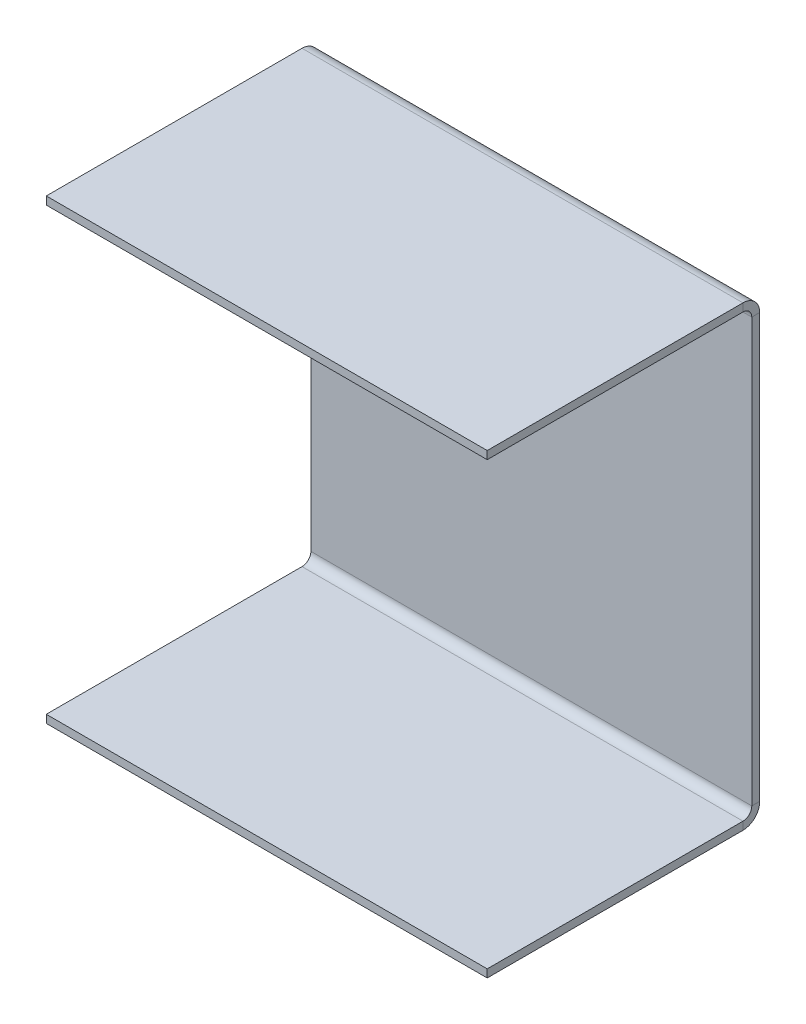
ISO-10303-21;
HEADER;
FILE_DESCRIPTION(('STEP AP214'),'2;1');
FILE_NAME('part.step','',(''),(''),'','','');
FILE_SCHEMA(('AUTOMOTIVE_DESIGN { 1 0 10303 214 1 1 1 1 }'));
ENDSEC;
DATA;
#1=APPLICATION_CONTEXT('core data for automotive mechanical design processes');
#2=APPLICATION_PROTOCOL_DEFINITION('international standard','automotive_design',2000,#1);
#3=PRODUCT_CONTEXT('',#1,'mechanical');
#4=PRODUCT('Part','Part','',(#3));
#5=PRODUCT_RELATED_PRODUCT_CATEGORY('part','',(#4));
#6=PRODUCT_DEFINITION_FORMATION('','',#4);
#7=PRODUCT_DEFINITION_CONTEXT('part definition',#1,'design');
#8=PRODUCT_DEFINITION('design','',#6,#7);
#9=PRODUCT_DEFINITION_SHAPE('','',#8);
#10=(LENGTH_UNIT() NAMED_UNIT(*) SI_UNIT(.MILLI.,.METRE.));
#11=(NAMED_UNIT(*) PLANE_ANGLE_UNIT() SI_UNIT($,.RADIAN.));
#12=(NAMED_UNIT(*) SI_UNIT($,.STERADIAN.) SOLID_ANGLE_UNIT());
#13=UNCERTAINTY_MEASURE_WITH_UNIT(LENGTH_MEASURE(1.E-05),#10,'distance_accuracy_value','');
#14=(GEOMETRIC_REPRESENTATION_CONTEXT(3) GLOBAL_UNCERTAINTY_ASSIGNED_CONTEXT((#13)) GLOBAL_UNIT_ASSIGNED_CONTEXT((#10,
#11,#12)) REPRESENTATION_CONTEXT('',''));
#15=CARTESIAN_POINT('',(0.,0.,0.));
#16=DIRECTION('',(0.,0.,1.));
#17=DIRECTION('',(1.,0.,0.));
#18=AXIS2_PLACEMENT_3D('',#15,#16,#17);
#19=CARTESIAN_POINT('',(0.,0.,-0.9));
#20=DIRECTION('',(0.,0.,1.));
#21=DIRECTION('',(1.,0.,0.));
#22=AXIS2_PLACEMENT_3D('',#19,#20,#21);
#23=PLANE('',#22);
#24=DIRECTION('',(1.,0.,0.));
#25=VECTOR('',#24,1.);
#26=CARTESIAN_POINT('',(25.,-24.,-0.9));
#27=LINE('',#26,#25);
#28=CARTESIAN_POINT('',(25.,-24.,-0.9));
#29=VERTEX_POINT('',#28);
#30=CARTESIAN_POINT('',(-25.,-24.,-0.9));
#31=VERTEX_POINT('',#30);
#32=EDGE_CURVE('E135',#29,#31,#27,.F.);
#33=ORIENTED_EDGE('',*,*,#32,.T.);
#34=DIRECTION('',(0.,-1.,0.));
#35=VECTOR('',#34,1.);
#36=CARTESIAN_POINT('',(-25.,25.,-0.9));
#37=LINE('',#36,#35);
#38=CARTESIAN_POINT('',(-25.,24.,-0.9));
#39=VERTEX_POINT('',#38);
#40=EDGE_CURVE('E46',#39,#31,#37,.T.);
#41=ORIENTED_EDGE('',*,*,#40,.F.);
#42=DIRECTION('',(-1.,0.,0.));
#43=VECTOR('',#42,1.);
#44=CARTESIAN_POINT('',(-25.,24.,-0.9));
#45=LINE('',#44,#43);
#46=CARTESIAN_POINT('',(25.,24.,-0.9));
#47=VERTEX_POINT('',#46);
#48=EDGE_CURVE('E224',#39,#47,#45,.F.);
#49=ORIENTED_EDGE('',*,*,#48,.T.);
#50=DIRECTION('',(0.,1.,0.));
#51=VECTOR('',#50,1.);
#52=CARTESIAN_POINT('',(25.,25.,-0.9));
#53=LINE('',#52,#51);
#54=EDGE_CURVE('E11',#29,#47,#53,.T.);
#55=ORIENTED_EDGE('',*,*,#54,.F.);
#56=EDGE_LOOP('',(#33,#41,#49,#55));
#57=FACE_BOUND('',#56,.T.);
#58=ADVANCED_FACE('F37',(#57),#23,.F.);
#59=CARTESIAN_POINT('',(0.,0.,0.));
#60=DIRECTION('',(0.,0.,1.));
#61=DIRECTION('',(1.,0.,0.));
#62=AXIS2_PLACEMENT_3D('',#59,#60,#61);
#63=PLANE('',#62);
#64=DIRECTION('',(0.,-1.,0.));
#65=VECTOR('',#64,1.);
#66=CARTESIAN_POINT('',(-25.,25.,0.));
#67=LINE('',#66,#65);
#68=CARTESIAN_POINT('',(-25.,24.,0.));
#69=VERTEX_POINT('',#68);
#70=CARTESIAN_POINT('',(-25.,-24.,0.));
#71=VERTEX_POINT('',#70);
#72=EDGE_CURVE('E242',#69,#71,#67,.T.);
#73=ORIENTED_EDGE('',*,*,#72,.T.);
#74=DIRECTION('',(1.,0.,0.));
#75=VECTOR('',#74,1.);
#76=CARTESIAN_POINT('',(25.,-24.,0.));
#77=LINE('',#76,#75);
#78=CARTESIAN_POINT('',(25.,-24.,0.));
#79=VERTEX_POINT('',#78);
#80=EDGE_CURVE('E185',#79,#71,#77,.F.);
#81=ORIENTED_EDGE('',*,*,#80,.F.);
#82=DIRECTION('',(0.,1.,0.));
#83=VECTOR('',#82,1.);
#84=CARTESIAN_POINT('',(25.,25.,0.));
#85=LINE('',#84,#83);
#86=CARTESIAN_POINT('',(25.,24.,0.));
#87=VERTEX_POINT('',#86);
#88=EDGE_CURVE('E41',#79,#87,#85,.T.);
#89=ORIENTED_EDGE('',*,*,#88,.T.);
#90=DIRECTION('',(-1.,0.,0.));
#91=VECTOR('',#90,1.);
#92=CARTESIAN_POINT('',(-25.,24.,0.));
#93=LINE('',#92,#91);
#94=EDGE_CURVE('E54',#69,#87,#93,.F.);
#95=ORIENTED_EDGE('',*,*,#94,.F.);
#96=EDGE_LOOP('',(#73,#81,#89,#95));
#97=FACE_BOUND('',#96,.T.);
#98=ADVANCED_FACE('F247',(#97),#63,.T.);
#99=CARTESIAN_POINT('',(25.,25.,-0.9));
#100=DIRECTION('',(1.,0.,0.));
#101=DIRECTION('',(0.,1.,0.));
#102=AXIS2_PLACEMENT_3D('',#99,#100,#101);
#103=PLANE('',#102);
#104=ORIENTED_EDGE('',*,*,#88,.F.);
#105=DIRECTION('',(0.,0.,-1.));
#106=VECTOR('',#105,1.);
#107=CARTESIAN_POINT('',(25.,-24.,0.));
#108=LINE('',#107,#106);
#109=EDGE_CURVE('E181',#79,#29,#108,.T.);
#110=ORIENTED_EDGE('',*,*,#109,.T.);
#111=ORIENTED_EDGE('',*,*,#54,.T.);
#112=DIRECTION('',(0.,0.,-1.));
#113=VECTOR('',#112,1.);
#114=CARTESIAN_POINT('',(25.,24.,0.));
#115=LINE('',#114,#113);
#116=EDGE_CURVE('E239',#87,#47,#115,.T.);
#117=ORIENTED_EDGE('',*,*,#116,.F.);
#118=EDGE_LOOP('',(#104,#110,#111,#117));
#119=FACE_BOUND('',#118,.T.);
#120=ADVANCED_FACE('F248',(#119),#103,.T.);
#121=CARTESIAN_POINT('',(-25.,25.,-0.9));
#122=DIRECTION('',(-1.,0.,0.));
#123=DIRECTION('',(0.,-1.,0.));
#124=AXIS2_PLACEMENT_3D('',#121,#122,#123);
#125=PLANE('',#124);
#126=DIRECTION('',(0.,0.,-1.));
#127=VECTOR('',#126,1.);
#128=CARTESIAN_POINT('',(-25.,-24.,0.));
#129=LINE('',#128,#127);
#130=EDGE_CURVE('E189',#71,#31,#129,.T.);
#131=ORIENTED_EDGE('',*,*,#130,.F.);
#132=ORIENTED_EDGE('',*,*,#72,.F.);
#133=DIRECTION('',(0.,0.,-1.));
#134=VECTOR('',#133,1.);
#135=CARTESIAN_POINT('',(-25.,24.,0.));
#136=LINE('',#135,#134);
#137=EDGE_CURVE('E230',#69,#39,#136,.T.);
#138=ORIENTED_EDGE('',*,*,#137,.T.);
#139=ORIENTED_EDGE('',*,*,#40,.T.);
#140=EDGE_LOOP('',(#131,#132,#138,#139));
#141=FACE_BOUND('',#140,.T.);
#142=ADVANCED_FACE('F39',(#141),#125,.T.);
#143=CARTESIAN_POINT('',(25.,24.,1.));
#144=DIRECTION('',(1.,0.,0.));
#145=DIRECTION('',(0.,0.,-1.));
#146=AXIS2_PLACEMENT_3D('',#143,#144,#145);
#147=PLANE('',#146);
#148=DIRECTION('',(0.,1.,0.));
#149=VECTOR('',#148,1.);
#150=CARTESIAN_POINT('',(25.,25.,0.999999999999997));
#151=LINE('',#150,#149);
#152=CARTESIAN_POINT('',(25.,25.,0.999999999999997));
#153=VERTEX_POINT('',#152);
#154=CARTESIAN_POINT('',(25.,25.9,0.999999999999994));
#155=VERTEX_POINT('',#154);
#156=EDGE_CURVE('E192',#153,#155,#151,.T.);
#157=ORIENTED_EDGE('',*,*,#156,.F.);
#158=CARTESIAN_POINT('',(25.,24.,1.));
#159=DIRECTION('',(-1.,0.,0.));
#160=DIRECTION('',(0.,0.,1.));
#161=AXIS2_PLACEMENT_3D('',#158,#159,#160);
#162=CIRCLE('',#161,1.);
#163=EDGE_CURVE('E233',#87,#153,#162,.F.);
#164=ORIENTED_EDGE('',*,*,#163,.F.);
#165=ORIENTED_EDGE('',*,*,#116,.T.);
#166=CARTESIAN_POINT('',(25.,24.,1.));
#167=DIRECTION('',(-1.,0.,0.));
#168=DIRECTION('',(0.,0.,1.));
#169=AXIS2_PLACEMENT_3D('',#166,#167,#168);
#170=CIRCLE('',#169,1.9);
#171=EDGE_CURVE('E226',#47,#155,#170,.F.);
#172=ORIENTED_EDGE('',*,*,#171,.T.);
#173=EDGE_LOOP('',(#157,#164,#165,#172));
#174=FACE_BOUND('',#173,.T.);
#175=ADVANCED_FACE('F256',(#174),#147,.T.);
#176=CARTESIAN_POINT('',(-25.,24.,1.));
#177=DIRECTION('',(1.,0.,0.));
#178=DIRECTION('',(0.,0.,-1.));
#179=AXIS2_PLACEMENT_3D('',#176,#177,#178);
#180=PLANE('',#179);
#181=CARTESIAN_POINT('',(-25.,24.,1.));
#182=DIRECTION('',(-1.,0.,0.));
#183=DIRECTION('',(0.,0.,1.));
#184=AXIS2_PLACEMENT_3D('',#181,#182,#183);
#185=CIRCLE('',#184,1.);
#186=CARTESIAN_POINT('',(-25.,25.,0.999999999999997));
#187=VERTEX_POINT('',#186);
#188=EDGE_CURVE('E223',#187,#69,#185,.T.);
#189=ORIENTED_EDGE('',*,*,#188,.F.);
#190=DIRECTION('',(0.,1.,0.));
#191=VECTOR('',#190,1.);
#192=CARTESIAN_POINT('',(-25.,25.,0.999999999999997));
#193=LINE('',#192,#191);
#194=CARTESIAN_POINT('',(-25.,25.9,0.999999999999994));
#195=VERTEX_POINT('',#194);
#196=EDGE_CURVE('E196',#187,#195,#193,.T.);
#197=ORIENTED_EDGE('',*,*,#196,.T.);
#198=CARTESIAN_POINT('',(-25.,24.,1.));
#199=DIRECTION('',(-1.,0.,0.));
#200=DIRECTION('',(0.,0.,1.));
#201=AXIS2_PLACEMENT_3D('',#198,#199,#200);
#202=CIRCLE('',#201,1.9);
#203=EDGE_CURVE('E227',#195,#39,#202,.T.);
#204=ORIENTED_EDGE('',*,*,#203,.T.);
#205=ORIENTED_EDGE('',*,*,#137,.F.);
#206=EDGE_LOOP('',(#189,#197,#204,#205));
#207=FACE_BOUND('',#206,.T.);
#208=ADVANCED_FACE('F277',(#207),#180,.F.);
#209=CARTESIAN_POINT('',(-25.,24.,1.));
#210=DIRECTION('',(-1.,0.,0.));
#211=DIRECTION('',(0.,1.,0.));
#212=AXIS2_PLACEMENT_3D('',#209,#210,#211);
#213=CYLINDRICAL_SURFACE('',#212,1.9);
#214=ORIENTED_EDGE('',*,*,#48,.F.);
#215=ORIENTED_EDGE('',*,*,#203,.F.);
#216=DIRECTION('',(1.,0.,0.));
#217=VECTOR('',#216,1.);
#218=CARTESIAN_POINT('',(0.,25.9,0.999999999999994));
#219=LINE('',#218,#217);
#220=EDGE_CURVE('E199',#195,#155,#219,.T.);
#221=ORIENTED_EDGE('',*,*,#220,.T.);
#222=ORIENTED_EDGE('',*,*,#171,.F.);
#223=EDGE_LOOP('',(#214,#215,#221,#222));
#224=FACE_BOUND('',#223,.T.);
#225=ADVANCED_FACE('F471',(#224),#213,.T.);
#226=CARTESIAN_POINT('',(-25.,24.,1.));
#227=DIRECTION('',(-1.,0.,0.));
#228=DIRECTION('',(0.,1.,0.));
#229=AXIS2_PLACEMENT_3D('',#226,#227,#228);
#230=CYLINDRICAL_SURFACE('',#229,1.);
#231=ORIENTED_EDGE('',*,*,#94,.T.);
#232=ORIENTED_EDGE('',*,*,#163,.T.);
#233=DIRECTION('',(-1.,0.,0.));
#234=VECTOR('',#233,1.);
#235=CARTESIAN_POINT('',(25.,25.,0.999999999999997));
#236=LINE('',#235,#234);
#237=EDGE_CURVE('E194',#153,#187,#236,.T.);
#238=ORIENTED_EDGE('',*,*,#237,.T.);
#239=ORIENTED_EDGE('',*,*,#188,.T.);
#240=EDGE_LOOP('',(#231,#232,#238,#239));
#241=FACE_BOUND('',#240,.T.);
#242=ADVANCED_FACE('F253',(#241),#230,.F.);
#243=CARTESIAN_POINT('',(25.,25.9,0.));
#244=DIRECTION('',(-1.,0.,0.));
#245=DIRECTION('',(0.,0.,1.));
#246=AXIS2_PLACEMENT_3D('',#243,#244,#245);
#247=PLANE('',#246);
#248=ORIENTED_EDGE('',*,*,#156,.T.);
#249=DIRECTION('',(0.,0.,-1.));
#250=VECTOR('',#249,1.);
#251=CARTESIAN_POINT('',(25.,25.9,0.));
#252=LINE('',#251,#250);
#253=CARTESIAN_POINT('',(25.,25.9000000000001,30.));
#254=VERTEX_POINT('',#253);
#255=EDGE_CURVE('E204',#254,#155,#252,.T.);
#256=ORIENTED_EDGE('',*,*,#255,.F.);
#257=DIRECTION('',(0.,-1.,0.));
#258=VECTOR('',#257,1.);
#259=CARTESIAN_POINT('',(25.,25.9000000000001,30.));
#260=LINE('',#259,#258);
#261=CARTESIAN_POINT('',(25.,25.0000000000001,30.));
#262=VERTEX_POINT('',#261);
#263=EDGE_CURVE('E212',#254,#262,#260,.T.);
#264=ORIENTED_EDGE('',*,*,#263,.T.);
#265=DIRECTION('',(0.,0.,-1.));
#266=VECTOR('',#265,1.);
#267=CARTESIAN_POINT('',(25.,25.,0.));
#268=LINE('',#267,#266);
#269=EDGE_CURVE('E203',#262,#153,#268,.T.);
#270=ORIENTED_EDGE('',*,*,#269,.T.);
#271=EDGE_LOOP('',(#248,#256,#264,#270));
#272=FACE_BOUND('',#271,.T.);
#273=ADVANCED_FACE('F259',(#272),#247,.F.);
#274=CARTESIAN_POINT('',(-25.,25.9000000000001,30.));
#275=DIRECTION('',(1.,0.,0.));
#276=DIRECTION('',(0.,0.,-1.));
#277=AXIS2_PLACEMENT_3D('',#274,#275,#276);
#278=PLANE('',#277);
#279=ORIENTED_EDGE('',*,*,#196,.F.);
#280=DIRECTION('',(0.,0.,1.));
#281=VECTOR('',#280,1.);
#282=CARTESIAN_POINT('',(-25.,25.0000000000001,30.));
#283=LINE('',#282,#281);
#284=CARTESIAN_POINT('',(-25.,25.0000000000001,30.));
#285=VERTEX_POINT('',#284);
#286=EDGE_CURVE('E215',#187,#285,#283,.T.);
#287=ORIENTED_EDGE('',*,*,#286,.T.);
#288=DIRECTION('',(0.,-1.,0.));
#289=VECTOR('',#288,1.);
#290=CARTESIAN_POINT('',(-25.,25.9000000000001,30.));
#291=LINE('',#290,#289);
#292=CARTESIAN_POINT('',(-25.,25.9000000000001,30.));
#293=VERTEX_POINT('',#292);
#294=EDGE_CURVE('E220',#293,#285,#291,.T.);
#295=ORIENTED_EDGE('',*,*,#294,.F.);
#296=DIRECTION('',(0.,0.,1.));
#297=VECTOR('',#296,1.);
#298=CARTESIAN_POINT('',(-25.,25.9000000000001,30.));
#299=LINE('',#298,#297);
#300=EDGE_CURVE('E207',#195,#293,#299,.T.);
#301=ORIENTED_EDGE('',*,*,#300,.F.);
#302=EDGE_LOOP('',(#279,#287,#295,#301));
#303=FACE_BOUND('',#302,.T.);
#304=ADVANCED_FACE('F279',(#303),#278,.F.);
#305=CARTESIAN_POINT('',(0.,25.9,0.));
#306=DIRECTION('',(0.,-1.,0.));
#307=DIRECTION('',(0.,0.,-1.));
#308=AXIS2_PLACEMENT_3D('',#305,#306,#307);
#309=PLANE('',#308);
#310=ORIENTED_EDGE('',*,*,#220,.F.);
#311=ORIENTED_EDGE('',*,*,#300,.T.);
#312=DIRECTION('',(1.,0.,0.));
#313=VECTOR('',#312,1.);
#314=CARTESIAN_POINT('',(25.,25.9000000000001,30.));
#315=LINE('',#314,#313);
#316=EDGE_CURVE('E210',#293,#254,#315,.T.);
#317=ORIENTED_EDGE('',*,*,#316,.T.);
#318=ORIENTED_EDGE('',*,*,#255,.T.);
#319=EDGE_LOOP('',(#310,#311,#317,#318));
#320=FACE_BOUND('',#319,.T.);
#321=ADVANCED_FACE('F263',(#320),#309,.F.);
#322=CARTESIAN_POINT('',(0.,25.,0.));
#323=DIRECTION('',(0.,-1.,0.));
#324=DIRECTION('',(0.,0.,-1.));
#325=AXIS2_PLACEMENT_3D('',#322,#323,#324);
#326=PLANE('',#325);
#327=ORIENTED_EDGE('',*,*,#286,.F.);
#328=ORIENTED_EDGE('',*,*,#237,.F.);
#329=ORIENTED_EDGE('',*,*,#269,.F.);
#330=DIRECTION('',(1.,0.,0.));
#331=VECTOR('',#330,1.);
#332=CARTESIAN_POINT('',(25.,25.0000000000001,30.));
#333=LINE('',#332,#331);
#334=EDGE_CURVE('E208',#285,#262,#333,.T.);
#335=ORIENTED_EDGE('',*,*,#334,.F.);
#336=EDGE_LOOP('',(#327,#328,#329,#335));
#337=FACE_BOUND('',#336,.T.);
#338=ADVANCED_FACE('F273',(#337),#326,.T.);
#339=CARTESIAN_POINT('',(25.,25.9000000000001,30.));
#340=DIRECTION('',(0.,0.,-1.));
#341=DIRECTION('',(0.,1.,0.));
#342=AXIS2_PLACEMENT_3D('',#339,#340,#341);
#343=PLANE('',#342);
#344=ORIENTED_EDGE('',*,*,#334,.T.);
#345=ORIENTED_EDGE('',*,*,#263,.F.);
#346=ORIENTED_EDGE('',*,*,#316,.F.);
#347=ORIENTED_EDGE('',*,*,#294,.T.);
#348=EDGE_LOOP('',(#344,#345,#346,#347));
#349=FACE_BOUND('',#348,.T.);
#350=ADVANCED_FACE('F269',(#349),#343,.F.);
#351=CARTESIAN_POINT('',(-25.,-24.,1.));
#352=DIRECTION('',(-1.,0.,0.));
#353=DIRECTION('',(0.,0.,1.));
#354=AXIS2_PLACEMENT_3D('',#351,#352,#353);
#355=PLANE('',#354);
#356=DIRECTION('',(0.,-1.,0.));
#357=VECTOR('',#356,1.);
#358=CARTESIAN_POINT('',(-25.,-25.,0.999999999999997));
#359=LINE('',#358,#357);
#360=CARTESIAN_POINT('',(-25.,-25.,0.999999999999997));
#361=VERTEX_POINT('',#360);
#362=CARTESIAN_POINT('',(-25.,-25.9,0.999999999999994));
#363=VERTEX_POINT('',#362);
#364=EDGE_CURVE('E310',#361,#363,#359,.T.);
#365=ORIENTED_EDGE('',*,*,#364,.F.);
#366=CARTESIAN_POINT('',(-25.,-24.,1.));
#367=DIRECTION('',(1.,0.,0.));
#368=DIRECTION('',(0.,0.,-1.));
#369=AXIS2_PLACEMENT_3D('',#366,#367,#368);
#370=CIRCLE('',#369,1.);
#371=EDGE_CURVE('E138',#71,#361,#370,.F.);
#372=ORIENTED_EDGE('',*,*,#371,.F.);
#373=ORIENTED_EDGE('',*,*,#130,.T.);
#374=CARTESIAN_POINT('',(-25.,-24.,1.));
#375=DIRECTION('',(1.,0.,0.));
#376=DIRECTION('',(0.,0.,-1.));
#377=AXIS2_PLACEMENT_3D('',#374,#375,#376);
#378=CIRCLE('',#377,1.9);
#379=EDGE_CURVE('E180',#31,#363,#378,.F.);
#380=ORIENTED_EDGE('',*,*,#379,.T.);
#381=EDGE_LOOP('',(#365,#372,#373,#380));
#382=FACE_BOUND('',#381,.T.);
#383=ADVANCED_FACE('F308',(#382),#355,.T.);
#384=CARTESIAN_POINT('',(25.,-24.,1.));
#385=DIRECTION('',(-1.,0.,0.));
#386=DIRECTION('',(0.,0.,1.));
#387=AXIS2_PLACEMENT_3D('',#384,#385,#386);
#388=PLANE('',#387);
#389=CARTESIAN_POINT('',(25.,-24.,1.));
#390=DIRECTION('',(1.,0.,0.));
#391=DIRECTION('',(0.,0.,-1.));
#392=AXIS2_PLACEMENT_3D('',#389,#390,#391);
#393=CIRCLE('',#392,1.);
#394=CARTESIAN_POINT('',(25.,-25.,0.999999999999997));
#395=VERTEX_POINT('',#394);
#396=EDGE_CURVE('E145',#395,#79,#393,.T.);
#397=ORIENTED_EDGE('',*,*,#396,.F.);
#398=DIRECTION('',(0.,-1.,0.));
#399=VECTOR('',#398,1.);
#400=CARTESIAN_POINT('',(25.,-25.,0.999999999999997));
#401=LINE('',#400,#399);
#402=CARTESIAN_POINT('',(25.,-25.9,0.999999999999994));
#403=VERTEX_POINT('',#402);
#404=EDGE_CURVE('E142',#395,#403,#401,.T.);
#405=ORIENTED_EDGE('',*,*,#404,.T.);
#406=CARTESIAN_POINT('',(25.,-24.,1.));
#407=DIRECTION('',(1.,0.,0.));
#408=DIRECTION('',(0.,0.,-1.));
#409=AXIS2_PLACEMENT_3D('',#406,#407,#408);
#410=CIRCLE('',#409,1.9);
#411=EDGE_CURVE('E128',#403,#29,#410,.T.);
#412=ORIENTED_EDGE('',*,*,#411,.T.);
#413=ORIENTED_EDGE('',*,*,#109,.F.);
#414=EDGE_LOOP('',(#397,#405,#412,#413));
#415=FACE_BOUND('',#414,.T.);
#416=ADVANCED_FACE('F143',(#415),#388,.F.);
#417=CARTESIAN_POINT('',(25.,-24.,1.));
#418=DIRECTION('',(1.,0.,0.));
#419=DIRECTION('',(0.,-1.,0.));
#420=AXIS2_PLACEMENT_3D('',#417,#418,#419);
#421=CYLINDRICAL_SURFACE('',#420,1.9);
#422=ORIENTED_EDGE('',*,*,#32,.F.);
#423=ORIENTED_EDGE('',*,*,#411,.F.);
#424=DIRECTION('',(-1.,0.,0.));
#425=VECTOR('',#424,1.);
#426=CARTESIAN_POINT('',(0.,-25.9,0.999999999999994));
#427=LINE('',#426,#425);
#428=EDGE_CURVE('E133',#403,#363,#427,.T.);
#429=ORIENTED_EDGE('',*,*,#428,.T.);
#430=ORIENTED_EDGE('',*,*,#379,.F.);
#431=EDGE_LOOP('',(#422,#423,#429,#430));
#432=FACE_BOUND('',#431,.T.);
#433=ADVANCED_FACE('F130',(#432),#421,.T.);
#434=CARTESIAN_POINT('',(25.,-24.,1.));
#435=DIRECTION('',(1.,0.,0.));
#436=DIRECTION('',(0.,-1.,0.));
#437=AXIS2_PLACEMENT_3D('',#434,#435,#436);
#438=CYLINDRICAL_SURFACE('',#437,1.);
#439=ORIENTED_EDGE('',*,*,#80,.T.);
#440=ORIENTED_EDGE('',*,*,#371,.T.);
#441=DIRECTION('',(1.,0.,0.));
#442=VECTOR('',#441,1.);
#443=CARTESIAN_POINT('',(-25.,-25.,0.999999999999997));
#444=LINE('',#443,#442);
#445=EDGE_CURVE('E149',#361,#395,#444,.T.);
#446=ORIENTED_EDGE('',*,*,#445,.T.);
#447=ORIENTED_EDGE('',*,*,#396,.T.);
#448=EDGE_LOOP('',(#439,#440,#446,#447));
#449=FACE_BOUND('',#448,.T.);
#450=ADVANCED_FACE('F313',(#449),#438,.F.);
#451=CARTESIAN_POINT('',(-25.,-25.9,0.));
#452=DIRECTION('',(1.,0.,0.));
#453=DIRECTION('',(0.,0.,-1.));
#454=AXIS2_PLACEMENT_3D('',#451,#452,#453);
#455=PLANE('',#454);
#456=ORIENTED_EDGE('',*,*,#364,.T.);
#457=DIRECTION('',(0.,0.,-1.));
#458=VECTOR('',#457,1.);
#459=CARTESIAN_POINT('',(-25.,-25.9,0.));
#460=LINE('',#459,#458);
#461=CARTESIAN_POINT('',(-25.,-25.9000000000001,30.));
#462=VERTEX_POINT('',#461);
#463=EDGE_CURVE('E157',#462,#363,#460,.T.);
#464=ORIENTED_EDGE('',*,*,#463,.F.);
#465=DIRECTION('',(0.,1.,0.));
#466=VECTOR('',#465,1.);
#467=CARTESIAN_POINT('',(-25.,-25.9000000000001,30.));
#468=LINE('',#467,#466);
#469=CARTESIAN_POINT('',(-25.,-25.0000000000001,30.));
#470=VERTEX_POINT('',#469);
#471=EDGE_CURVE('E166',#462,#470,#468,.T.);
#472=ORIENTED_EDGE('',*,*,#471,.T.);
#473=DIRECTION('',(0.,0.,-1.));
#474=VECTOR('',#473,1.);
#475=CARTESIAN_POINT('',(-25.,-25.,0.));
#476=LINE('',#475,#474);
#477=EDGE_CURVE('E158',#470,#361,#476,.T.);
#478=ORIENTED_EDGE('',*,*,#477,.T.);
#479=EDGE_LOOP('',(#456,#464,#472,#478));
#480=FACE_BOUND('',#479,.T.);
#481=ADVANCED_FACE('F320',(#480),#455,.F.);
#482=CARTESIAN_POINT('',(25.,-25.9000000000001,30.));
#483=DIRECTION('',(-1.,0.,0.));
#484=DIRECTION('',(0.,0.,1.));
#485=AXIS2_PLACEMENT_3D('',#482,#483,#484);
#486=PLANE('',#485);
#487=ORIENTED_EDGE('',*,*,#404,.F.);
#488=DIRECTION('',(0.,0.,1.));
#489=VECTOR('',#488,1.);
#490=CARTESIAN_POINT('',(25.,-25.0000000000001,30.));
#491=LINE('',#490,#489);
#492=CARTESIAN_POINT('',(25.,-25.0000000000001,30.));
#493=VERTEX_POINT('',#492);
#494=EDGE_CURVE('E173',#395,#493,#491,.T.);
#495=ORIENTED_EDGE('',*,*,#494,.T.);
#496=DIRECTION('',(0.,1.,0.));
#497=VECTOR('',#496,1.);
#498=CARTESIAN_POINT('',(25.,-25.9000000000001,30.));
#499=LINE('',#498,#497);
#500=CARTESIAN_POINT('',(25.,-25.9000000000001,30.));
#501=VERTEX_POINT('',#500);
#502=EDGE_CURVE('E162',#501,#493,#499,.T.);
#503=ORIENTED_EDGE('',*,*,#502,.F.);
#504=DIRECTION('',(0.,0.,1.));
#505=VECTOR('',#504,1.);
#506=CARTESIAN_POINT('',(25.,-25.9000000000001,30.));
#507=LINE('',#506,#505);
#508=EDGE_CURVE('E154',#403,#501,#507,.T.);
#509=ORIENTED_EDGE('',*,*,#508,.F.);
#510=EDGE_LOOP('',(#487,#495,#503,#509));
#511=FACE_BOUND('',#510,.T.);
#512=ADVANCED_FACE('F160',(#511),#486,.F.);
#513=CARTESIAN_POINT('',(0.,-25.9,0.));
#514=DIRECTION('',(0.,1.,0.));
#515=DIRECTION('',(0.,0.,1.));
#516=AXIS2_PLACEMENT_3D('',#513,#514,#515);
#517=PLANE('',#516);
#518=ORIENTED_EDGE('',*,*,#428,.F.);
#519=ORIENTED_EDGE('',*,*,#508,.T.);
#520=DIRECTION('',(-1.,0.,0.));
#521=VECTOR('',#520,1.);
#522=CARTESIAN_POINT('',(-25.,-25.9000000000001,30.));
#523=LINE('',#522,#521);
#524=EDGE_CURVE('E164',#501,#462,#523,.T.);
#525=ORIENTED_EDGE('',*,*,#524,.T.);
#526=ORIENTED_EDGE('',*,*,#463,.T.);
#527=EDGE_LOOP('',(#518,#519,#525,#526));
#528=FACE_BOUND('',#527,.T.);
#529=ADVANCED_FACE('F153',(#528),#517,.F.);
#530=CARTESIAN_POINT('',(0.,-25.,0.));
#531=DIRECTION('',(0.,1.,0.));
#532=DIRECTION('',(0.,0.,1.));
#533=AXIS2_PLACEMENT_3D('',#530,#531,#532);
#534=PLANE('',#533);
#535=ORIENTED_EDGE('',*,*,#494,.F.);
#536=ORIENTED_EDGE('',*,*,#445,.F.);
#537=ORIENTED_EDGE('',*,*,#477,.F.);
#538=DIRECTION('',(-1.,0.,0.));
#539=VECTOR('',#538,1.);
#540=CARTESIAN_POINT('',(-25.,-25.0000000000001,30.));
#541=LINE('',#540,#539);
#542=EDGE_CURVE('E168',#493,#470,#541,.T.);
#543=ORIENTED_EDGE('',*,*,#542,.F.);
#544=EDGE_LOOP('',(#535,#536,#537,#543));
#545=FACE_BOUND('',#544,.T.);
#546=ADVANCED_FACE('F316',(#545),#534,.T.);
#547=CARTESIAN_POINT('',(-25.,-25.9000000000001,30.));
#548=DIRECTION('',(0.,0.,-1.));
#549=DIRECTION('',(0.,1.,0.));
#550=AXIS2_PLACEMENT_3D('',#547,#548,#549);
#551=PLANE('',#550);
#552=ORIENTED_EDGE('',*,*,#542,.T.);
#553=ORIENTED_EDGE('',*,*,#471,.F.);
#554=ORIENTED_EDGE('',*,*,#524,.F.);
#555=ORIENTED_EDGE('',*,*,#502,.T.);
#556=EDGE_LOOP('',(#552,#553,#554,#555));
#557=FACE_BOUND('',#556,.T.);
#558=ADVANCED_FACE('F323',(#557),#551,.F.);
#559=CLOSED_SHELL('',(#58,#98,#120,#142,#175,#208,#225,#242,#273,#304,#321,#338,#350,#383,#416,
#433,#450,#481,#512,#529,#546,#558));
#560=MANIFOLD_SOLID_BREP('B2',#559);
#561=ADVANCED_BREP_SHAPE_REPRESENTATION('',(#18,#560),#14);
#562=SHAPE_DEFINITION_REPRESENTATION(#9,#561);
ENDSEC;
END-ISO-10303-21;
